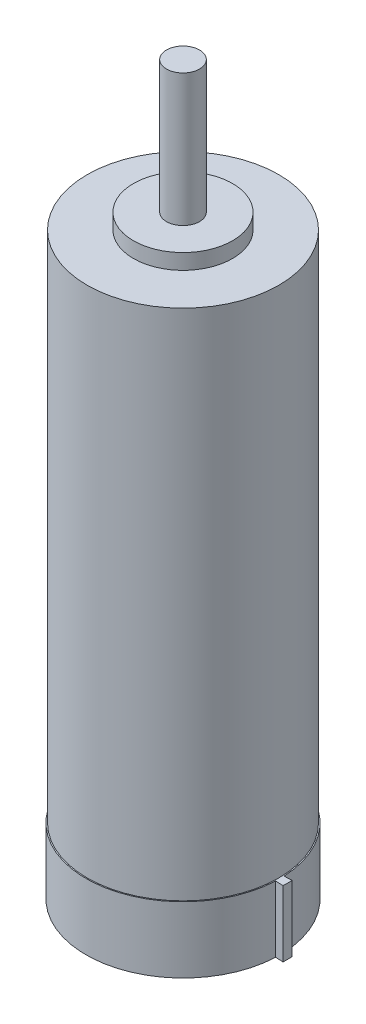
ISO-10303-21;
HEADER;
FILE_DESCRIPTION(('STEP AP214'),'2;1');
FILE_NAME('part.step','',(''),(''),'','','');
FILE_SCHEMA(('AUTOMOTIVE_DESIGN { 1 0 10303 214 1 1 1 1 }'));
ENDSEC;
DATA;
#1=APPLICATION_CONTEXT('core data for automotive mechanical design processes');
#2=APPLICATION_PROTOCOL_DEFINITION('international standard','automotive_design',2000,#1);
#3=PRODUCT_CONTEXT('',#1,'mechanical');
#4=PRODUCT('Part','Part','',(#3));
#5=PRODUCT_RELATED_PRODUCT_CATEGORY('part','',(#4));
#6=PRODUCT_DEFINITION_FORMATION('','',#4);
#7=PRODUCT_DEFINITION_CONTEXT('part definition',#1,'design');
#8=PRODUCT_DEFINITION('design','',#6,#7);
#9=PRODUCT_DEFINITION_SHAPE('','',#8);
#10=(LENGTH_UNIT() NAMED_UNIT(*) SI_UNIT(.MILLI.,.METRE.));
#11=(NAMED_UNIT(*) PLANE_ANGLE_UNIT() SI_UNIT($,.RADIAN.));
#12=(NAMED_UNIT(*) SI_UNIT($,.STERADIAN.) SOLID_ANGLE_UNIT());
#13=UNCERTAINTY_MEASURE_WITH_UNIT(LENGTH_MEASURE(1.E-05),#10,'distance_accuracy_value','');
#14=(GEOMETRIC_REPRESENTATION_CONTEXT(3) GLOBAL_UNCERTAINTY_ASSIGNED_CONTEXT((#13)) GLOBAL_UNIT_ASSIGNED_CONTEXT((#10,
#11,#12)) REPRESENTATION_CONTEXT('',''));
#15=CARTESIAN_POINT('',(0.,0.,0.));
#16=DIRECTION('',(0.,0.,1.));
#17=DIRECTION('',(1.,0.,0.));
#18=AXIS2_PLACEMENT_3D('',#15,#16,#17);
#19=CARTESIAN_POINT('',(0.,6.,0.));
#20=DIRECTION('',(0.,-1.,0.));
#21=DIRECTION('',(0.,0.,-1.));
#22=AXIS2_PLACEMENT_3D('',#19,#20,#21);
#23=CYLINDRICAL_SURFACE('',#22,8.8);
#24=DIRECTION('',(0.,1.,0.));
#25=VECTOR('',#24,1.);
#26=CARTESIAN_POINT('',(8.79162434992035,6.,-0.383850608814958));
#27=LINE('',#26,#25);
#28=CARTESIAN_POINT('',(8.79162434992035,0.,-0.383850608814958));
#29=VERTEX_POINT('',#28);
#30=CARTESIAN_POINT('',(8.79162434992035,6.,-0.383850608814958));
#31=VERTEX_POINT('',#30);
#32=EDGE_CURVE('E144',#29,#31,#27,.T.);
#33=ORIENTED_EDGE('',*,*,#32,.F.);
#34=CARTESIAN_POINT('',(0.,0.,0.));
#35=DIRECTION('',(0.,1.,0.));
#36=DIRECTION('',(0.,0.,1.));
#37=AXIS2_PLACEMENT_3D('',#34,#35,#36);
#38=CIRCLE('',#37,8.8);
#39=CARTESIAN_POINT('',(-8.79162434992035,0.,-0.383850608814958));
#40=VERTEX_POINT('',#39);
#41=EDGE_CURVE('E199',#29,#40,#38,.T.);
#42=ORIENTED_EDGE('',*,*,#41,.T.);
#43=DIRECTION('',(0.,1.,0.));
#44=VECTOR('',#43,1.);
#45=CARTESIAN_POINT('',(-8.79162434992035,6.,-0.383850608814958));
#46=LINE('',#45,#44);
#47=CARTESIAN_POINT('',(-8.79162434992035,6.,-0.383850608814958));
#48=VERTEX_POINT('',#47);
#49=EDGE_CURVE('E185',#40,#48,#46,.T.);
#50=ORIENTED_EDGE('',*,*,#49,.T.);
#51=CARTESIAN_POINT('',(0.,6.,0.));
#52=DIRECTION('',(0.,1.,0.));
#53=DIRECTION('',(0.,0.,1.));
#54=AXIS2_PLACEMENT_3D('',#51,#52,#53);
#55=CIRCLE('',#54,8.8);
#56=EDGE_CURVE('E56',#31,#48,#55,.T.);
#57=ORIENTED_EDGE('',*,*,#56,.F.);
#58=EDGE_LOOP('',(#33,#42,#50,#57));
#59=FACE_BOUND('',#58,.T.);
#60=ADVANCED_FACE('F39',(#59),#23,.T.);
#61=CARTESIAN_POINT('',(-8.79162434992035,0.,0.383850608814958));
#62=VERTEX_POINT('',#61);
#63=CARTESIAN_POINT('',(8.79162434992035,0.,0.383850608814958));
#64=VERTEX_POINT('',#63);
#65=EDGE_CURVE('E43',#62,#64,#38,.T.);
#66=ORIENTED_EDGE('',*,*,#65,.T.);
#67=DIRECTION('',(0.,1.,0.));
#68=VECTOR('',#67,1.);
#69=CARTESIAN_POINT('',(8.79162434992035,6.,0.383850608814958));
#70=LINE('',#69,#68);
#71=CARTESIAN_POINT('',(8.79162434992035,6.,0.383850608814958));
#72=VERTEX_POINT('',#71);
#73=EDGE_CURVE('E64',#64,#72,#70,.T.);
#74=ORIENTED_EDGE('',*,*,#73,.T.);
#75=CARTESIAN_POINT('',(-8.79162434992035,6.,0.383850608814958));
#76=VERTEX_POINT('',#75);
#77=EDGE_CURVE('E147',#76,#72,#55,.T.);
#78=ORIENTED_EDGE('',*,*,#77,.F.);
#79=DIRECTION('',(0.,1.,0.));
#80=VECTOR('',#79,1.);
#81=CARTESIAN_POINT('',(-8.79162434992035,6.,0.383850608814958));
#82=LINE('',#81,#80);
#83=EDGE_CURVE('E173',#62,#76,#82,.T.);
#84=ORIENTED_EDGE('',*,*,#83,.F.);
#85=EDGE_LOOP('',(#66,#74,#78,#84));
#86=FACE_BOUND('',#85,.T.);
#87=ADVANCED_FACE('F41',(#86),#23,.T.);
#88=CARTESIAN_POINT('',(0.,6.,0.));
#89=DIRECTION('',(0.,1.,0.));
#90=DIRECTION('',(0.,0.,1.));
#91=AXIS2_PLACEMENT_3D('',#88,#89,#90);
#92=PLANE('',#91);
#93=CARTESIAN_POINT('',(0.,6.,0.));
#94=DIRECTION('',(0.,1.,0.));
#95=DIRECTION('',(0.,0.,1.));
#96=AXIS2_PLACEMENT_3D('',#93,#94,#95);
#97=CIRCLE('',#96,8.7);
#98=CARTESIAN_POINT('',(0.,6.,8.7));
#99=VERTEX_POINT('',#98);
#100=EDGE_CURVE('E141',#99,#99,#97,.T.);
#101=ORIENTED_EDGE('',*,*,#100,.F.);
#102=EDGE_LOOP('',(#101));
#103=FACE_BOUND('',#102,.T.);
#104=ORIENTED_EDGE('',*,*,#77,.T.);
#105=DIRECTION('',(0.999048221581858,0.,0.0436193873653361));
#106=VECTOR('',#105,1.);
#107=CARTESIAN_POINT('',(8.79162434992035,6.,0.383850608814958));
#108=LINE('',#107,#106);
#109=CARTESIAN_POINT('',(9.49095810502765,6.,0.414384179970693));
#110=VERTEX_POINT('',#109);
#111=EDGE_CURVE('E160',#72,#110,#108,.T.);
#112=ORIENTED_EDGE('',*,*,#111,.T.);
#113=CARTESIAN_POINT('',(0.,6.,0.));
#114=DIRECTION('',(0.,1.,0.));
#115=DIRECTION('',(0.,0.,-1.));
#116=AXIS2_PLACEMENT_3D('',#113,#114,#115);
#117=CIRCLE('',#116,9.5);
#118=CARTESIAN_POINT('',(9.49095810502765,6.,-0.414384179970693));
#119=VERTEX_POINT('',#118);
#120=EDGE_CURVE('E169',#110,#119,#117,.T.);
#121=ORIENTED_EDGE('',*,*,#120,.T.);
#122=DIRECTION('',(0.999048221581858,0.,-0.0436193873653361));
#123=VECTOR('',#122,1.);
#124=CARTESIAN_POINT('',(8.79162434992035,6.,-0.383850608814958));
#125=LINE('',#124,#123);
#126=EDGE_CURVE('E150',#31,#119,#125,.T.);
#127=ORIENTED_EDGE('',*,*,#126,.F.);
#128=ORIENTED_EDGE('',*,*,#56,.T.);
#129=DIRECTION('',(-0.999048221581858,0.,-0.0436193873653361));
#130=VECTOR('',#129,1.);
#131=CARTESIAN_POINT('',(-8.79162434992035,6.,-0.383850608814958));
#132=LINE('',#131,#130);
#133=CARTESIAN_POINT('',(-9.49095810502765,6.,-0.414384179970693));
#134=VERTEX_POINT('',#133);
#135=EDGE_CURVE('E187',#48,#134,#132,.T.);
#136=ORIENTED_EDGE('',*,*,#135,.T.);
#137=CARTESIAN_POINT('',(0.,6.,0.));
#138=DIRECTION('',(0.,1.,0.));
#139=DIRECTION('',(0.,0.,1.));
#140=AXIS2_PLACEMENT_3D('',#137,#138,#139);
#141=CIRCLE('',#140,9.5);
#142=CARTESIAN_POINT('',(-9.49095810502765,6.,0.414384179970693));
#143=VERTEX_POINT('',#142);
#144=EDGE_CURVE('E196',#134,#143,#141,.T.);
#145=ORIENTED_EDGE('',*,*,#144,.T.);
#146=DIRECTION('',(-0.999048221581858,0.,0.0436193873653361));
#147=VECTOR('',#146,1.);
#148=CARTESIAN_POINT('',(-8.79162434992035,6.,0.383850608814958));
#149=LINE('',#148,#147);
#150=EDGE_CURVE('E176',#76,#143,#149,.T.);
#151=ORIENTED_EDGE('',*,*,#150,.F.);
#152=EDGE_LOOP('',(#104,#112,#121,#127,#128,#136,#145,#151));
#153=FACE_BOUND('',#152,.T.);
#154=ADVANCED_FACE('F214',(#103,#153),#92,.T.);
#155=CARTESIAN_POINT('',(0.,0.,0.));
#156=DIRECTION('',(0.,1.,0.));
#157=DIRECTION('',(0.,0.,1.));
#158=AXIS2_PLACEMENT_3D('',#155,#156,#157);
#159=PLANE('',#158);
#160=CARTESIAN_POINT('',(6.72,0.,0.));
#161=DIRECTION('',(0.,-1.,0.));
#162=DIRECTION('',(0.,0.,-1.));
#163=AXIS2_PLACEMENT_3D('',#160,#161,#162);
#164=CIRCLE('',#163,0.999999999999989);
#165=CARTESIAN_POINT('',(6.72,0.,-0.999999999999989));
#166=VERTEX_POINT('',#165);
#167=EDGE_CURVE('E122',#166,#166,#164,.T.);
#168=ORIENTED_EDGE('',*,*,#167,.F.);
#169=EDGE_LOOP('',(#168));
#170=FACE_BOUND('',#169,.T.);
#171=CARTESIAN_POINT('',(-6.72,0.,0.));
#172=DIRECTION('',(0.,-1.,0.));
#173=DIRECTION('',(0.,0.,-1.));
#174=AXIS2_PLACEMENT_3D('',#171,#172,#173);
#175=CIRCLE('',#174,0.999999999999999);
#176=CARTESIAN_POINT('',(-6.72,0.,-1.));
#177=VERTEX_POINT('',#176);
#178=EDGE_CURVE('E121',#177,#177,#175,.T.);
#179=ORIENTED_EDGE('',*,*,#178,.F.);
#180=EDGE_LOOP('',(#179));
#181=FACE_BOUND('',#180,.T.);
#182=ORIENTED_EDGE('',*,*,#65,.F.);
#183=DIRECTION('',(0.999048221581858,0.,-0.0436193873653361));
#184=VECTOR('',#183,1.);
#185=CARTESIAN_POINT('',(-8.79162434992035,0.,0.383850608814958));
#186=LINE('',#185,#184);
#187=CARTESIAN_POINT('',(-9.49095810502765,0.,0.414384179970693));
#188=VERTEX_POINT('',#187);
#189=EDGE_CURVE('E182',#188,#62,#186,.T.);
#190=ORIENTED_EDGE('',*,*,#189,.F.);
#191=CARTESIAN_POINT('',(0.,0.,0.));
#192=DIRECTION('',(0.,1.,0.));
#193=DIRECTION('',(0.,0.,1.));
#194=AXIS2_PLACEMENT_3D('',#191,#192,#193);
#195=CIRCLE('',#194,9.5);
#196=CARTESIAN_POINT('',(-9.49095810502765,0.,-0.414384179970693));
#197=VERTEX_POINT('',#196);
#198=EDGE_CURVE('E198',#197,#188,#195,.T.);
#199=ORIENTED_EDGE('',*,*,#198,.F.);
#200=DIRECTION('',(0.999048221581858,0.,0.0436193873653361));
#201=VECTOR('',#200,1.);
#202=CARTESIAN_POINT('',(-8.79162434992035,0.,-0.383850608814958));
#203=LINE('',#202,#201);
#204=EDGE_CURVE('E193',#197,#40,#203,.T.);
#205=ORIENTED_EDGE('',*,*,#204,.T.);
#206=ORIENTED_EDGE('',*,*,#41,.F.);
#207=DIRECTION('',(-0.999048221581858,0.,0.0436193873653361));
#208=VECTOR('',#207,1.);
#209=CARTESIAN_POINT('',(8.79162434992035,0.,-0.383850608814958));
#210=LINE('',#209,#208);
#211=CARTESIAN_POINT('',(9.49095810502765,0.,-0.414384179970693));
#212=VERTEX_POINT('',#211);
#213=EDGE_CURVE('E156',#212,#29,#210,.T.);
#214=ORIENTED_EDGE('',*,*,#213,.F.);
#215=CARTESIAN_POINT('',(0.,0.,0.));
#216=DIRECTION('',(0.,1.,0.));
#217=DIRECTION('',(0.,0.,-1.));
#218=AXIS2_PLACEMENT_3D('',#215,#216,#217);
#219=CIRCLE('',#218,9.5);
#220=CARTESIAN_POINT('',(9.49095810502765,0.,0.414384179970693));
#221=VERTEX_POINT('',#220);
#222=EDGE_CURVE('E171',#221,#212,#219,.T.);
#223=ORIENTED_EDGE('',*,*,#222,.F.);
#224=DIRECTION('',(-0.999048221581858,0.,-0.0436193873653361));
#225=VECTOR('',#224,1.);
#226=CARTESIAN_POINT('',(8.79162434992035,0.,0.383850608814958));
#227=LINE('',#226,#225);
#228=EDGE_CURVE('E166',#221,#64,#227,.T.);
#229=ORIENTED_EDGE('',*,*,#228,.T.);
#230=EDGE_LOOP('',(#182,#190,#199,#205,#206,#214,#223,#229));
#231=FACE_BOUND('',#230,.T.);
#232=ADVANCED_FACE('F209',(#170,#181,#231),#159,.F.);
#233=CARTESIAN_POINT('',(0.,1.18363998579866,0.));
#234=DIRECTION('',(0.,1.,0.));
#235=DIRECTION('',(0.,0.,1.));
#236=AXIS2_PLACEMENT_3D('',#233,#234,#235);
#237=CYLINDRICAL_SURFACE('',#236,9.5);
#238=ORIENTED_EDGE('',*,*,#144,.F.);
#239=DIRECTION('',(0.,-1.,0.));
#240=VECTOR('',#239,1.);
#241=CARTESIAN_POINT('',(-9.49095810502765,6.,-0.414384179970693));
#242=LINE('',#241,#240);
#243=EDGE_CURVE('E190',#134,#197,#242,.T.);
#244=ORIENTED_EDGE('',*,*,#243,.T.);
#245=ORIENTED_EDGE('',*,*,#198,.T.);
#246=DIRECTION('',(0.,-1.,0.));
#247=VECTOR('',#246,1.);
#248=CARTESIAN_POINT('',(-9.49095810502765,6.,0.414384179970693));
#249=LINE('',#248,#247);
#250=EDGE_CURVE('E179',#143,#188,#249,.T.);
#251=ORIENTED_EDGE('',*,*,#250,.F.);
#252=EDGE_LOOP('',(#238,#244,#245,#251));
#253=FACE_BOUND('',#252,.T.);
#254=ADVANCED_FACE('F219',(#253),#237,.T.);
#255=CARTESIAN_POINT('',(0.,0.,0.));
#256=DIRECTION('',(0.0436193873653361,0.,-0.999048221581858));
#257=DIRECTION('',(-0.999048221581858,0.,-0.0436193873653361));
#258=AXIS2_PLACEMENT_3D('',#255,#256,#257);
#259=PLANE('',#258);
#260=ORIENTED_EDGE('',*,*,#49,.F.);
#261=ORIENTED_EDGE('',*,*,#204,.F.);
#262=ORIENTED_EDGE('',*,*,#243,.F.);
#263=ORIENTED_EDGE('',*,*,#135,.F.);
#264=EDGE_LOOP('',(#260,#261,#262,#263));
#265=FACE_BOUND('',#264,.T.);
#266=ADVANCED_FACE('F213',(#265),#259,.T.);
#267=CARTESIAN_POINT('',(0.,0.,0.));
#268=DIRECTION('',(-0.0436193873653361,0.,-0.999048221581858));
#269=DIRECTION('',(-0.999048221581858,0.,0.0436193873653361));
#270=AXIS2_PLACEMENT_3D('',#267,#268,#269);
#271=PLANE('',#270);
#272=ORIENTED_EDGE('',*,*,#83,.T.);
#273=ORIENTED_EDGE('',*,*,#150,.T.);
#274=ORIENTED_EDGE('',*,*,#250,.T.);
#275=ORIENTED_EDGE('',*,*,#189,.T.);
#276=EDGE_LOOP('',(#272,#273,#274,#275));
#277=FACE_BOUND('',#276,.T.);
#278=ADVANCED_FACE('F218',(#277),#271,.F.);
#279=CARTESIAN_POINT('',(0.,1.18363998579866,0.));
#280=DIRECTION('',(0.,1.,0.));
#281=DIRECTION('',(0.,0.,-1.));
#282=AXIS2_PLACEMENT_3D('',#279,#280,#281);
#283=CYLINDRICAL_SURFACE('',#282,9.5);
#284=ORIENTED_EDGE('',*,*,#120,.F.);
#285=DIRECTION('',(0.,-1.,0.));
#286=VECTOR('',#285,1.);
#287=CARTESIAN_POINT('',(9.49095810502765,6.,0.414384179970693));
#288=LINE('',#287,#286);
#289=EDGE_CURVE('E163',#110,#221,#288,.T.);
#290=ORIENTED_EDGE('',*,*,#289,.T.);
#291=ORIENTED_EDGE('',*,*,#222,.T.);
#292=DIRECTION('',(0.,-1.,0.));
#293=VECTOR('',#292,1.);
#294=CARTESIAN_POINT('',(9.49095810502765,6.,-0.414384179970693));
#295=LINE('',#294,#293);
#296=EDGE_CURVE('E153',#119,#212,#295,.T.);
#297=ORIENTED_EDGE('',*,*,#296,.F.);
#298=EDGE_LOOP('',(#284,#290,#291,#297));
#299=FACE_BOUND('',#298,.T.);
#300=ADVANCED_FACE('F262',(#299),#283,.T.);
#301=CARTESIAN_POINT('',(0.,0.,0.));
#302=DIRECTION('',(-0.0436193873653361,0.,0.999048221581858));
#303=DIRECTION('',(0.999048221581858,0.,0.0436193873653361));
#304=AXIS2_PLACEMENT_3D('',#301,#302,#303);
#305=PLANE('',#304);
#306=ORIENTED_EDGE('',*,*,#73,.F.);
#307=ORIENTED_EDGE('',*,*,#228,.F.);
#308=ORIENTED_EDGE('',*,*,#289,.F.);
#309=ORIENTED_EDGE('',*,*,#111,.F.);
#310=EDGE_LOOP('',(#306,#307,#308,#309));
#311=FACE_BOUND('',#310,.T.);
#312=ADVANCED_FACE('F254',(#311),#305,.T.);
#313=CARTESIAN_POINT('',(0.,0.,0.));
#314=DIRECTION('',(0.0436193873653361,0.,0.999048221581858));
#315=DIRECTION('',(0.999048221581858,0.,-0.0436193873653361));
#316=AXIS2_PLACEMENT_3D('',#313,#314,#315);
#317=PLANE('',#316);
#318=ORIENTED_EDGE('',*,*,#32,.T.);
#319=ORIENTED_EDGE('',*,*,#126,.T.);
#320=ORIENTED_EDGE('',*,*,#296,.T.);
#321=ORIENTED_EDGE('',*,*,#213,.T.);
#322=EDGE_LOOP('',(#318,#319,#320,#321));
#323=FACE_BOUND('',#322,.T.);
#324=ADVANCED_FACE('F244',(#323),#317,.F.);
#325=CARTESIAN_POINT('',(0.,52.6,0.));
#326=DIRECTION('',(0.,-1.,0.));
#327=DIRECTION('',(0.,0.,-1.));
#328=AXIS2_PLACEMENT_3D('',#325,#326,#327);
#329=CYLINDRICAL_SURFACE('',#328,8.7);
#330=CARTESIAN_POINT('',(0.,52.6,0.));
#331=DIRECTION('',(0.,1.,0.));
#332=DIRECTION('',(0.,0.,1.));
#333=AXIS2_PLACEMENT_3D('',#330,#331,#332);
#334=CIRCLE('',#333,8.7);
#335=CARTESIAN_POINT('',(0.,52.6,8.7));
#336=VERTEX_POINT('',#335);
#337=EDGE_CURVE('E138',#336,#336,#334,.T.);
#338=ORIENTED_EDGE('',*,*,#337,.F.);
#339=EDGE_LOOP('',(#338));
#340=FACE_BOUND('',#339,.T.);
#341=ORIENTED_EDGE('',*,*,#100,.T.);
#342=EDGE_LOOP('',(#341));
#343=FACE_BOUND('',#342,.T.);
#344=ADVANCED_FACE('F241',(#340,#343),#329,.T.);
#345=CARTESIAN_POINT('',(0.,52.6,0.));
#346=DIRECTION('',(0.,1.,0.));
#347=DIRECTION('',(0.,0.,1.));
#348=AXIS2_PLACEMENT_3D('',#345,#346,#347);
#349=PLANE('',#348);
#350=CARTESIAN_POINT('',(0.,52.6,0.));
#351=DIRECTION('',(0.,1.,0.));
#352=DIRECTION('',(0.,0.,1.));
#353=AXIS2_PLACEMENT_3D('',#350,#351,#352);
#354=CIRCLE('',#353,4.5);
#355=CARTESIAN_POINT('',(0.,52.6,4.5));
#356=VERTEX_POINT('',#355);
#357=EDGE_CURVE('E48',#356,#356,#354,.T.);
#358=ORIENTED_EDGE('',*,*,#357,.F.);
#359=EDGE_LOOP('',(#358));
#360=FACE_BOUND('',#359,.T.);
#361=ORIENTED_EDGE('',*,*,#337,.T.);
#362=EDGE_LOOP('',(#361));
#363=FACE_BOUND('',#362,.T.);
#364=ADVANCED_FACE('F243',(#360,#363),#349,.T.);
#365=CARTESIAN_POINT('',(0.,54.,0.));
#366=DIRECTION('',(0.,-1.,0.));
#367=DIRECTION('',(0.,0.,-1.));
#368=AXIS2_PLACEMENT_3D('',#365,#366,#367);
#369=CYLINDRICAL_SURFACE('',#368,4.5);
#370=CARTESIAN_POINT('',(0.,54.,0.));
#371=DIRECTION('',(0.,1.,0.));
#372=DIRECTION('',(0.,0.,1.));
#373=AXIS2_PLACEMENT_3D('',#370,#371,#372);
#374=CIRCLE('',#373,4.5);
#375=CARTESIAN_POINT('',(0.,54.,4.5));
#376=VERTEX_POINT('',#375);
#377=EDGE_CURVE('E134',#376,#376,#374,.T.);
#378=ORIENTED_EDGE('',*,*,#377,.F.);
#379=EDGE_LOOP('',(#378));
#380=FACE_BOUND('',#379,.T.);
#381=ORIENTED_EDGE('',*,*,#357,.T.);
#382=EDGE_LOOP('',(#381));
#383=FACE_BOUND('',#382,.T.);
#384=ADVANCED_FACE('F251',(#380,#383),#369,.T.);
#385=CARTESIAN_POINT('',(0.,54.,0.));
#386=DIRECTION('',(0.,1.,0.));
#387=DIRECTION('',(0.,0.,1.));
#388=AXIS2_PLACEMENT_3D('',#385,#386,#387);
#389=PLANE('',#388);
#390=CARTESIAN_POINT('',(0.,54.,0.));
#391=DIRECTION('',(0.,1.,0.));
#392=DIRECTION('',(0.,0.,1.));
#393=AXIS2_PLACEMENT_3D('',#390,#391,#392);
#394=CIRCLE('',#393,1.5);
#395=CARTESIAN_POINT('',(0.,54.,1.5));
#396=VERTEX_POINT('',#395);
#397=EDGE_CURVE('E11',#396,#396,#394,.T.);
#398=ORIENTED_EDGE('',*,*,#397,.F.);
#399=EDGE_LOOP('',(#398));
#400=FACE_BOUND('',#399,.T.);
#401=ORIENTED_EDGE('',*,*,#377,.T.);
#402=EDGE_LOOP('',(#401));
#403=FACE_BOUND('',#402,.T.);
#404=ADVANCED_FACE('F313',(#400,#403),#389,.T.);
#405=CARTESIAN_POINT('',(0.,66.,0.));
#406=DIRECTION('',(0.,-1.,0.));
#407=DIRECTION('',(0.,0.,-1.));
#408=AXIS2_PLACEMENT_3D('',#405,#406,#407);
#409=CYLINDRICAL_SURFACE('',#408,1.5);
#410=CARTESIAN_POINT('',(0.,66.,0.));
#411=DIRECTION('',(0.,1.,0.));
#412=DIRECTION('',(0.,0.,1.));
#413=AXIS2_PLACEMENT_3D('',#410,#411,#412);
#414=CIRCLE('',#413,1.5);
#415=CARTESIAN_POINT('',(0.,66.,1.5));
#416=VERTEX_POINT('',#415);
#417=EDGE_CURVE('E132',#416,#416,#414,.T.);
#418=ORIENTED_EDGE('',*,*,#417,.F.);
#419=EDGE_LOOP('',(#418));
#420=FACE_BOUND('',#419,.T.);
#421=ORIENTED_EDGE('',*,*,#397,.T.);
#422=EDGE_LOOP('',(#421));
#423=FACE_BOUND('',#422,.T.);
#424=ADVANCED_FACE('F323',(#420,#423),#409,.T.);
#425=CARTESIAN_POINT('',(0.,66.,0.));
#426=DIRECTION('',(0.,1.,0.));
#427=DIRECTION('',(0.,0.,1.));
#428=AXIS2_PLACEMENT_3D('',#425,#426,#427);
#429=PLANE('',#428);
#430=ORIENTED_EDGE('',*,*,#417,.T.);
#431=EDGE_LOOP('',(#430));
#432=FACE_BOUND('',#431,.T.);
#433=ADVANCED_FACE('F334',(#432),#429,.T.);
#434=CARTESIAN_POINT('',(-6.72,5.,0.));
#435=DIRECTION('',(0.,-1.,0.));
#436=DIRECTION('',(0.,0.,-1.));
#437=AXIS2_PLACEMENT_3D('',#434,#435,#436);
#438=CONICAL_SURFACE('',#437,0.999999999999998,1.02974425867665);
#439=CARTESIAN_POINT('',(-6.72,5.60086061902756,0.));
#440=VERTEX_POINT('',#439);
#441=VERTEX_LOOP('',#440);
#442=FACE_BOUND('',#441,.T.);
#443=CARTESIAN_POINT('',(-6.72,5.,0.));
#444=DIRECTION('',(0.,-1.,0.));
#445=DIRECTION('',(0.,0.,-1.));
#446=AXIS2_PLACEMENT_3D('',#443,#444,#445);
#447=CIRCLE('',#446,0.999999999999998);
#448=CARTESIAN_POINT('',(-6.72,5.,-0.999999999999999));
#449=VERTEX_POINT('',#448);
#450=EDGE_CURVE('E125',#449,#449,#447,.T.);
#451=ORIENTED_EDGE('',*,*,#450,.T.);
#452=EDGE_LOOP('',(#451));
#453=FACE_BOUND('',#452,.T.);
#454=ADVANCED_FACE('F345',(#442,#453),#438,.F.);
#455=CARTESIAN_POINT('',(-6.72,0.,0.));
#456=DIRECTION('',(0.,-1.,0.));
#457=DIRECTION('',(0.,0.,-1.));
#458=AXIS2_PLACEMENT_3D('',#455,#456,#457);
#459=CYLINDRICAL_SURFACE('',#458,0.999999999999999);
#460=ORIENTED_EDGE('',*,*,#450,.F.);
#461=EDGE_LOOP('',(#460));
#462=FACE_BOUND('',#461,.T.);
#463=ORIENTED_EDGE('',*,*,#178,.T.);
#464=EDGE_LOOP('',(#463));
#465=FACE_BOUND('',#464,.T.);
#466=ADVANCED_FACE('F115',(#462,#465),#459,.F.);
#467=CARTESIAN_POINT('',(6.72,5.,0.));
#468=DIRECTION('',(0.,-1.,0.));
#469=DIRECTION('',(0.,0.,-1.));
#470=AXIS2_PLACEMENT_3D('',#467,#468,#469);
#471=CONICAL_SURFACE('',#470,0.999999999999987,1.02974425867665);
#472=CARTESIAN_POINT('',(6.72,5.60086061902756,0.));
#473=VERTEX_POINT('',#472);
#474=VERTEX_LOOP('',#473);
#475=FACE_BOUND('',#474,.T.);
#476=CARTESIAN_POINT('',(6.72,5.,0.));
#477=DIRECTION('',(0.,-1.,0.));
#478=DIRECTION('',(0.,0.,-1.));
#479=AXIS2_PLACEMENT_3D('',#476,#477,#478);
#480=CIRCLE('',#479,0.999999999999987);
#481=CARTESIAN_POINT('',(6.72,5.,-0.999999999999987));
#482=VERTEX_POINT('',#481);
#483=EDGE_CURVE('E119',#482,#482,#480,.T.);
#484=ORIENTED_EDGE('',*,*,#483,.T.);
#485=EDGE_LOOP('',(#484));
#486=FACE_BOUND('',#485,.T.);
#487=ADVANCED_FACE('F111',(#475,#486),#471,.F.);
#488=CARTESIAN_POINT('',(6.72,0.,0.));
#489=DIRECTION('',(0.,-1.,0.));
#490=DIRECTION('',(0.,0.,-1.));
#491=AXIS2_PLACEMENT_3D('',#488,#489,#490);
#492=CYLINDRICAL_SURFACE('',#491,0.999999999999988);
#493=ORIENTED_EDGE('',*,*,#483,.F.);
#494=EDGE_LOOP('',(#493));
#495=FACE_BOUND('',#494,.T.);
#496=ORIENTED_EDGE('',*,*,#167,.T.);
#497=EDGE_LOOP('',(#496));
#498=FACE_BOUND('',#497,.T.);
#499=ADVANCED_FACE('F114',(#495,#498),#492,.F.);
#500=CLOSED_SHELL('',(#60,#87,#154,#232,#254,#266,#278,#300,#312,#324,#344,#364,#384,#404,#424,
#433,#454,#466,#487,#499));
#501=MANIFOLD_SOLID_BREP('B2',#500);
#502=ADVANCED_BREP_SHAPE_REPRESENTATION('',(#18,#501),#14);
#503=SHAPE_DEFINITION_REPRESENTATION(#9,#502);
ENDSEC;
END-ISO-10303-21;
